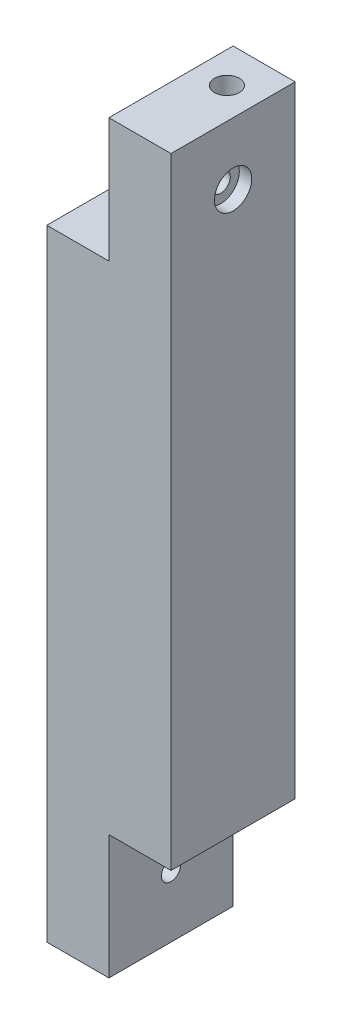
ISO-10303-21;
HEADER;
FILE_DESCRIPTION(('STEP AP214'),'2;1');
FILE_NAME('part.step','',(''),(''),'','','');
FILE_SCHEMA(('AUTOMOTIVE_DESIGN { 1 0 10303 214 1 1 1 1 }'));
ENDSEC;
DATA;
#1=APPLICATION_CONTEXT('core data for automotive mechanical design processes');
#2=APPLICATION_PROTOCOL_DEFINITION('international standard','automotive_design',2000,#1);
#3=PRODUCT_CONTEXT('',#1,'mechanical');
#4=PRODUCT('Part','Part','',(#3));
#5=PRODUCT_RELATED_PRODUCT_CATEGORY('part','',(#4));
#6=PRODUCT_DEFINITION_FORMATION('','',#4);
#7=PRODUCT_DEFINITION_CONTEXT('part definition',#1,'design');
#8=PRODUCT_DEFINITION('design','',#6,#7);
#9=PRODUCT_DEFINITION_SHAPE('','',#8);
#10=(LENGTH_UNIT() NAMED_UNIT(*) SI_UNIT(.MILLI.,.METRE.));
#11=(NAMED_UNIT(*) PLANE_ANGLE_UNIT() SI_UNIT($,.RADIAN.));
#12=(NAMED_UNIT(*) SI_UNIT($,.STERADIAN.) SOLID_ANGLE_UNIT());
#13=UNCERTAINTY_MEASURE_WITH_UNIT(LENGTH_MEASURE(1.E-05),#10,'distance_accuracy_value','');
#14=(GEOMETRIC_REPRESENTATION_CONTEXT(3) GLOBAL_UNCERTAINTY_ASSIGNED_CONTEXT((#13)) GLOBAL_UNIT_ASSIGNED_CONTEXT((#10,
#11,#12)) REPRESENTATION_CONTEXT('',''));
#15=CARTESIAN_POINT('',(0.,0.,0.));
#16=DIRECTION('',(0.,0.,1.));
#17=DIRECTION('',(1.,0.,0.));
#18=AXIS2_PLACEMENT_3D('',#15,#16,#17);
#19=CARTESIAN_POINT('',(-27.9813215779807,10.,6.45386967852447));
#20=DIRECTION('',(1.,0.,0.));
#21=DIRECTION('',(0.,0.,-1.));
#22=AXIS2_PLACEMENT_3D('',#19,#20,#21);
#23=CYLINDRICAL_SURFACE('',#22,1.55);
#24=CARTESIAN_POINT('',(-7.98132157798069,10.,6.45386967852447));
#25=DIRECTION('',(1.,0.,0.));
#26=DIRECTION('',(0.,0.,-1.));
#27=AXIS2_PLACEMENT_3D('',#24,#25,#26);
#28=CIRCLE('',#27,1.55);
#29=CARTESIAN_POINT('',(-7.98132157798069,10.,4.90386967852447));
#30=VERTEX_POINT('',#29);
#31=EDGE_CURVE('E218',#30,#30,#28,.T.);
#32=ORIENTED_EDGE('',*,*,#31,.T.);
#33=EDGE_LOOP('',(#32));
#34=FACE_BOUND('',#33,.T.);
#35=CARTESIAN_POINT('',(-15.9813215779807,10.,6.45386967852447));
#36=DIRECTION('',(-1.,0.,0.));
#37=DIRECTION('',(0.,0.,1.));
#38=AXIS2_PLACEMENT_3D('',#35,#36,#37);
#39=CIRCLE('',#38,1.55);
#40=CARTESIAN_POINT('',(-15.9813215779807,10.,8.00386967852447));
#41=VERTEX_POINT('',#40);
#42=EDGE_CURVE('E54',#41,#41,#39,.F.);
#43=ORIENTED_EDGE('',*,*,#42,.F.);
#44=EDGE_LOOP('',(#43));
#45=FACE_BOUND('',#44,.T.);
#46=ADVANCED_FACE('F50',(#34,#45),#23,.F.);
#47=CARTESIAN_POINT('',(112.018678422019,110.,6.45386967852447));
#48=DIRECTION('',(-1.,0.,0.));
#49=DIRECTION('',(0.,-1.,0.));
#50=AXIS2_PLACEMENT_3D('',#47,#48,#49);
#51=CYLINDRICAL_SURFACE('',#50,1.55);
#52=CARTESIAN_POINT('',(-7.98132157798068,110.,6.45386967852447));
#53=DIRECTION('',(-1.,0.,0.));
#54=DIRECTION('',(0.,-1.,0.));
#55=AXIS2_PLACEMENT_3D('',#52,#53,#54);
#56=CIRCLE('',#55,1.55);
#57=CARTESIAN_POINT('',(-7.98132157798068,108.45,6.45386967852447));
#58=VERTEX_POINT('',#57);
#59=EDGE_CURVE('E133',#58,#58,#56,.T.);
#60=ORIENTED_EDGE('',*,*,#59,.T.);
#61=EDGE_LOOP('',(#60));
#62=FACE_BOUND('',#61,.T.);
#63=CARTESIAN_POINT('',(0.0186784220193165,110.,6.45386967852447));
#64=DIRECTION('',(1.,0.,0.));
#65=DIRECTION('',(0.,0.,-1.));
#66=AXIS2_PLACEMENT_3D('',#63,#64,#65);
#67=CIRCLE('',#66,1.55);
#68=CARTESIAN_POINT('',(0.0186784220193162,110.,4.90386967852447));
#69=VERTEX_POINT('',#68);
#70=EDGE_CURVE('E202',#69,#69,#67,.F.);
#71=ORIENTED_EDGE('',*,*,#70,.F.);
#72=EDGE_LOOP('',(#71));
#73=FACE_BOUND('',#72,.T.);
#74=ADVANCED_FACE('F265',(#62,#73),#51,.F.);
#75=CARTESIAN_POINT('',(0.,0.,0.));
#76=DIRECTION('',(0.,-1.,0.));
#77=DIRECTION('',(0.,0.,-1.));
#78=AXIS2_PLACEMENT_3D('',#75,#76,#77);
#79=PLANE('',#78);
#80=DIRECTION('',(1.,0.,0.));
#81=VECTOR('',#80,1.);
#82=CARTESIAN_POINT('',(-17.9813215779807,0.,-3.54613032147553));
#83=LINE('',#82,#81);
#84=CARTESIAN_POINT('',(-17.9813215779807,0.,-3.54613032147553));
#85=VERTEX_POINT('',#84);
#86=CARTESIAN_POINT('',(-7.98132157798069,0.,-3.54613032147554));
#87=VERTEX_POINT('',#86);
#88=EDGE_CURVE('E179',#85,#87,#83,.T.);
#89=ORIENTED_EDGE('',*,*,#88,.T.);
#90=DIRECTION('',(0.,0.,1.));
#91=VECTOR('',#90,1.);
#92=CARTESIAN_POINT('',(-7.98132157798069,0.,0.));
#93=LINE('',#92,#91);
#94=CARTESIAN_POINT('',(-7.98132157798069,0.,16.4538696785245));
#95=VERTEX_POINT('',#94);
#96=EDGE_CURVE('E60',#87,#95,#93,.T.);
#97=ORIENTED_EDGE('',*,*,#96,.T.);
#98=DIRECTION('',(1.,0.,0.));
#99=VECTOR('',#98,1.);
#100=CARTESIAN_POINT('',(-17.9813215779807,0.,16.4538696785245));
#101=LINE('',#100,#99);
#102=CARTESIAN_POINT('',(-17.9813215779807,0.,16.4538696785245));
#103=VERTEX_POINT('',#102);
#104=EDGE_CURVE('E137',#103,#95,#101,.T.);
#105=ORIENTED_EDGE('',*,*,#104,.F.);
#106=DIRECTION('',(0.,0.,1.));
#107=VECTOR('',#106,1.);
#108=CARTESIAN_POINT('',(-17.9813215779807,0.,-3.54613032147553));
#109=LINE('',#108,#107);
#110=EDGE_CURVE('E169',#85,#103,#109,.T.);
#111=ORIENTED_EDGE('',*,*,#110,.F.);
#112=EDGE_LOOP('',(#89,#97,#105,#111));
#113=FACE_BOUND('',#112,.T.);
#114=ADVANCED_FACE('F271',(#113),#79,.T.);
#115=CARTESIAN_POINT('',(0.,120.,0.));
#116=DIRECTION('',(0.,-1.,0.));
#117=DIRECTION('',(0.,0.,-1.));
#118=AXIS2_PLACEMENT_3D('',#115,#116,#117);
#119=PLANE('',#118);
#120=CARTESIAN_POINT('',(-2.98132157798069,120.,2.45386967852447));
#121=DIRECTION('',(0.,-1.,0.));
#122=DIRECTION('',(0.,0.,-1.));
#123=AXIS2_PLACEMENT_3D('',#120,#121,#122);
#124=CIRCLE('',#123,2.);
#125=CARTESIAN_POINT('',(-2.98132157798069,120.,0.453869678524467));
#126=VERTEX_POINT('',#125);
#127=EDGE_CURVE('E229',#126,#126,#124,.T.);
#128=ORIENTED_EDGE('',*,*,#127,.T.);
#129=EDGE_LOOP('',(#128));
#130=FACE_BOUND('',#129,.T.);
#131=DIRECTION('',(0.,0.,-1.));
#132=VECTOR('',#131,1.);
#133=CARTESIAN_POINT('',(-7.98132157798069,120.,0.));
#134=LINE('',#133,#132);
#135=CARTESIAN_POINT('',(-7.98132157798068,120.,16.4538696785245));
#136=VERTEX_POINT('',#135);
#137=CARTESIAN_POINT('',(-7.98132157798069,120.,-3.54613032147554));
#138=VERTEX_POINT('',#137);
#139=EDGE_CURVE('E198',#136,#138,#134,.T.);
#140=ORIENTED_EDGE('',*,*,#139,.F.);
#141=DIRECTION('',(1.,0.,0.));
#142=VECTOR('',#141,1.);
#143=CARTESIAN_POINT('',(-17.9813215779807,120.,16.4538696785245));
#144=LINE('',#143,#142);
#145=CARTESIAN_POINT('',(2.01867842201931,120.,16.4538696785245));
#146=VERTEX_POINT('',#145);
#147=EDGE_CURVE('E165',#136,#146,#144,.T.);
#148=ORIENTED_EDGE('',*,*,#147,.T.);
#149=DIRECTION('',(0.,0.,1.));
#150=VECTOR('',#149,1.);
#151=CARTESIAN_POINT('',(2.01867842201931,120.,-3.54613032147553));
#152=LINE('',#151,#150);
#153=CARTESIAN_POINT('',(2.01867842201931,120.,-3.54613032147553));
#154=VERTEX_POINT('',#153);
#155=EDGE_CURVE('E168',#154,#146,#152,.T.);
#156=ORIENTED_EDGE('',*,*,#155,.F.);
#157=DIRECTION('',(1.,0.,0.));
#158=VECTOR('',#157,1.);
#159=CARTESIAN_POINT('',(-17.9813215779807,120.,-3.54613032147553));
#160=LINE('',#159,#158);
#161=EDGE_CURVE('E173',#138,#154,#160,.T.);
#162=ORIENTED_EDGE('',*,*,#161,.F.);
#163=EDGE_LOOP('',(#140,#148,#156,#162));
#164=FACE_BOUND('',#163,.T.);
#165=ADVANCED_FACE('F241',(#130,#164),#119,.F.);
#166=CARTESIAN_POINT('',(-17.9813215779807,120.,16.4538696785245));
#167=DIRECTION('',(0.,0.,-1.));
#168=DIRECTION('',(-1.,0.,0.));
#169=AXIS2_PLACEMENT_3D('',#166,#167,#168);
#170=PLANE('',#169);
#171=DIRECTION('',(0.,1.,0.));
#172=VECTOR('',#171,1.);
#173=CARTESIAN_POINT('',(-7.98132157798069,0.,16.4538696785245));
#174=LINE('',#173,#172);
#175=CARTESIAN_POINT('',(-7.98132157798069,20.,16.4538696785245));
#176=VERTEX_POINT('',#175);
#177=EDGE_CURVE('E68',#95,#176,#174,.T.);
#178=ORIENTED_EDGE('',*,*,#177,.T.);
#179=DIRECTION('',(-1.,0.,0.));
#180=VECTOR('',#179,1.);
#181=CARTESIAN_POINT('',(2.01867842201931,20.,16.4538696785245));
#182=LINE('',#181,#180);
#183=CARTESIAN_POINT('',(2.01867842201931,20.,16.4538696785245));
#184=VERTEX_POINT('',#183);
#185=EDGE_CURVE('E126',#184,#176,#182,.T.);
#186=ORIENTED_EDGE('',*,*,#185,.F.);
#187=DIRECTION('',(0.,-1.,0.));
#188=VECTOR('',#187,1.);
#189=CARTESIAN_POINT('',(2.01867842201931,120.,16.4538696785245));
#190=LINE('',#189,#188);
#191=EDGE_CURVE('E195',#146,#184,#190,.T.);
#192=ORIENTED_EDGE('',*,*,#191,.F.);
#193=ORIENTED_EDGE('',*,*,#147,.F.);
#194=DIRECTION('',(0.,-1.,0.));
#195=VECTOR('',#194,1.);
#196=CARTESIAN_POINT('',(-7.98132157798069,120.,16.4538696785245));
#197=LINE('',#196,#195);
#198=CARTESIAN_POINT('',(-7.98132157798068,100.,16.4538696785245));
#199=VERTEX_POINT('',#198);
#200=EDGE_CURVE('E76',#136,#199,#197,.T.);
#201=ORIENTED_EDGE('',*,*,#200,.T.);
#202=DIRECTION('',(1.,0.,0.));
#203=VECTOR('',#202,1.);
#204=CARTESIAN_POINT('',(-17.9813215779807,100.,16.4538696785245));
#205=LINE('',#204,#203);
#206=CARTESIAN_POINT('',(-17.9813215779807,100.,16.4538696785245));
#207=VERTEX_POINT('',#206);
#208=EDGE_CURVE('E146',#207,#199,#205,.T.);
#209=ORIENTED_EDGE('',*,*,#208,.F.);
#210=DIRECTION('',(0.,-1.,0.));
#211=VECTOR('',#210,1.);
#212=CARTESIAN_POINT('',(-17.9813215779807,120.,16.4538696785245));
#213=LINE('',#212,#211);
#214=EDGE_CURVE('E176',#207,#103,#213,.T.);
#215=ORIENTED_EDGE('',*,*,#214,.T.);
#216=ORIENTED_EDGE('',*,*,#104,.T.);
#217=EDGE_LOOP('',(#178,#186,#192,#193,#201,#209,#215,#216));
#218=FACE_BOUND('',#217,.T.);
#219=ADVANCED_FACE('F52',(#218),#170,.F.);
#220=CARTESIAN_POINT('',(2.01867842201931,120.,-3.54613032147553));
#221=DIRECTION('',(1.,0.,0.));
#222=DIRECTION('',(0.,0.,-1.));
#223=AXIS2_PLACEMENT_3D('',#220,#221,#222);
#224=PLANE('',#223);
#225=CARTESIAN_POINT('',(2.01867842201931,110.,6.45386967852447));
#226=DIRECTION('',(1.,0.,0.));
#227=DIRECTION('',(0.,0.,-1.));
#228=AXIS2_PLACEMENT_3D('',#225,#226,#227);
#229=CIRCLE('',#228,3.);
#230=CARTESIAN_POINT('',(2.01867842201931,110.,3.45386967852447));
#231=VERTEX_POINT('',#230);
#232=EDGE_CURVE('E212',#231,#231,#229,.T.);
#233=ORIENTED_EDGE('',*,*,#232,.F.);
#234=EDGE_LOOP('',(#233));
#235=FACE_BOUND('',#234,.T.);
#236=DIRECTION('',(0.,0.,1.));
#237=VECTOR('',#236,1.);
#238=CARTESIAN_POINT('',(2.01867842201931,20.,-103.546130321476));
#239=LINE('',#238,#237);
#240=CARTESIAN_POINT('',(2.01867842201931,20.,-3.54613032147554));
#241=VERTEX_POINT('',#240);
#242=EDGE_CURVE('E123',#241,#184,#239,.T.);
#243=ORIENTED_EDGE('',*,*,#242,.F.);
#244=DIRECTION('',(0.,-1.,0.));
#245=VECTOR('',#244,1.);
#246=CARTESIAN_POINT('',(2.01867842201931,120.,-3.54613032147553));
#247=LINE('',#246,#245);
#248=EDGE_CURVE('E191',#154,#241,#247,.T.);
#249=ORIENTED_EDGE('',*,*,#248,.F.);
#250=ORIENTED_EDGE('',*,*,#155,.T.);
#251=ORIENTED_EDGE('',*,*,#191,.T.);
#252=EDGE_LOOP('',(#243,#249,#250,#251));
#253=FACE_BOUND('',#252,.T.);
#254=ADVANCED_FACE('F291',(#235,#253),#224,.T.);
#255=CARTESIAN_POINT('',(-17.9813215779807,120.,-3.54613032147553));
#256=DIRECTION('',(0.,0.,-1.));
#257=DIRECTION('',(-1.,0.,0.));
#258=AXIS2_PLACEMENT_3D('',#255,#256,#257);
#259=PLANE('',#258);
#260=DIRECTION('',(1.,0.,0.));
#261=VECTOR('',#260,1.);
#262=CARTESIAN_POINT('',(-17.9813215779807,20.,-3.54613032147553));
#263=LINE('',#262,#261);
#264=CARTESIAN_POINT('',(-7.98132157798069,20.,-3.54613032147554));
#265=VERTEX_POINT('',#264);
#266=EDGE_CURVE('E12',#265,#241,#263,.T.);
#267=ORIENTED_EDGE('',*,*,#266,.F.);
#268=DIRECTION('',(0.,-1.,0.));
#269=VECTOR('',#268,1.);
#270=CARTESIAN_POINT('',(-7.98132157798069,120.,-3.54613032147553));
#271=LINE('',#270,#269);
#272=EDGE_CURVE('E119',#265,#87,#271,.T.);
#273=ORIENTED_EDGE('',*,*,#272,.T.);
#274=ORIENTED_EDGE('',*,*,#88,.F.);
#275=DIRECTION('',(0.,-1.,0.));
#276=VECTOR('',#275,1.);
#277=CARTESIAN_POINT('',(-17.9813215779807,120.,-3.54613032147553));
#278=LINE('',#277,#276);
#279=CARTESIAN_POINT('',(-17.9813215779807,100.,-3.54613032147554));
#280=VERTEX_POINT('',#279);
#281=EDGE_CURVE('E188',#280,#85,#278,.T.);
#282=ORIENTED_EDGE('',*,*,#281,.F.);
#283=DIRECTION('',(-1.,0.,0.));
#284=VECTOR('',#283,1.);
#285=CARTESIAN_POINT('',(-17.9813215779807,100.,-3.54613032147553));
#286=LINE('',#285,#284);
#287=CARTESIAN_POINT('',(-7.98132157798068,100.,-3.54613032147554));
#288=VERTEX_POINT('',#287);
#289=EDGE_CURVE('E162',#288,#280,#286,.T.);
#290=ORIENTED_EDGE('',*,*,#289,.F.);
#291=DIRECTION('',(0.,1.,0.));
#292=VECTOR('',#291,1.);
#293=CARTESIAN_POINT('',(-7.98132157798069,120.,-3.54613032147553));
#294=LINE('',#293,#292);
#295=EDGE_CURVE('E156',#288,#138,#294,.T.);
#296=ORIENTED_EDGE('',*,*,#295,.T.);
#297=ORIENTED_EDGE('',*,*,#161,.T.);
#298=ORIENTED_EDGE('',*,*,#248,.T.);
#299=EDGE_LOOP('',(#267,#273,#274,#282,#290,#296,#297,#298));
#300=FACE_BOUND('',#299,.T.);
#301=ADVANCED_FACE('F294',(#300),#259,.T.);
#302=CARTESIAN_POINT('',(-17.9813215779807,120.,-3.54613032147553));
#303=DIRECTION('',(1.,0.,0.));
#304=DIRECTION('',(0.,0.,-1.));
#305=AXIS2_PLACEMENT_3D('',#302,#303,#304);
#306=PLANE('',#305);
#307=CARTESIAN_POINT('',(-17.9813215779807,10.,6.45386967852447));
#308=DIRECTION('',(-1.,0.,0.));
#309=DIRECTION('',(0.,0.,1.));
#310=AXIS2_PLACEMENT_3D('',#307,#308,#309);
#311=CIRCLE('',#310,3.);
#312=CARTESIAN_POINT('',(-17.9813215779807,10.,9.45386967852447));
#313=VERTEX_POINT('',#312);
#314=EDGE_CURVE('E224',#313,#313,#311,.T.);
#315=ORIENTED_EDGE('',*,*,#314,.F.);
#316=EDGE_LOOP('',(#315));
#317=FACE_BOUND('',#316,.T.);
#318=ORIENTED_EDGE('',*,*,#214,.F.);
#319=DIRECTION('',(0.,0.,1.));
#320=VECTOR('',#319,1.);
#321=CARTESIAN_POINT('',(-17.9813215779807,100.,-103.546130321476));
#322=LINE('',#321,#320);
#323=EDGE_CURVE('E153',#280,#207,#322,.T.);
#324=ORIENTED_EDGE('',*,*,#323,.F.);
#325=ORIENTED_EDGE('',*,*,#281,.T.);
#326=ORIENTED_EDGE('',*,*,#110,.T.);
#327=EDGE_LOOP('',(#318,#324,#325,#326));
#328=FACE_BOUND('',#327,.T.);
#329=ADVANCED_FACE('F307',(#317,#328),#306,.F.);
#330=CARTESIAN_POINT('',(-17.9813215779807,100.,-103.546130321476));
#331=DIRECTION('',(0.,-1.,0.));
#332=DIRECTION('',(0.,0.,-1.));
#333=AXIS2_PLACEMENT_3D('',#330,#331,#332);
#334=PLANE('',#333);
#335=ORIENTED_EDGE('',*,*,#289,.T.);
#336=ORIENTED_EDGE('',*,*,#323,.T.);
#337=ORIENTED_EDGE('',*,*,#208,.T.);
#338=DIRECTION('',(0.,0.,1.));
#339=VECTOR('',#338,1.);
#340=CARTESIAN_POINT('',(-7.98132157798068,100.,-103.546130321476));
#341=LINE('',#340,#339);
#342=EDGE_CURVE('E152',#288,#199,#341,.T.);
#343=ORIENTED_EDGE('',*,*,#342,.F.);
#344=EDGE_LOOP('',(#335,#336,#337,#343));
#345=FACE_BOUND('',#344,.T.);
#346=ADVANCED_FACE('F261',(#345),#334,.F.);
#347=CARTESIAN_POINT('',(-7.98132157798069,120.,-103.546130321476));
#348=DIRECTION('',(-1.,0.,0.));
#349=DIRECTION('',(0.,-1.,0.));
#350=AXIS2_PLACEMENT_3D('',#347,#348,#349);
#351=PLANE('',#350);
#352=ORIENTED_EDGE('',*,*,#59,.F.);
#353=EDGE_LOOP('',(#352));
#354=FACE_BOUND('',#353,.T.);
#355=ORIENTED_EDGE('',*,*,#342,.T.);
#356=ORIENTED_EDGE('',*,*,#200,.F.);
#357=ORIENTED_EDGE('',*,*,#139,.T.);
#358=ORIENTED_EDGE('',*,*,#295,.F.);
#359=EDGE_LOOP('',(#355,#356,#357,#358));
#360=FACE_BOUND('',#359,.T.);
#361=ADVANCED_FACE('F252',(#354,#360),#351,.T.);
#362=CARTESIAN_POINT('',(2.01867842201931,20.,-103.546130321476));
#363=DIRECTION('',(0.,1.,0.));
#364=DIRECTION('',(0.,0.,1.));
#365=AXIS2_PLACEMENT_3D('',#362,#363,#364);
#366=PLANE('',#365);
#367=CARTESIAN_POINT('',(-2.98132157798069,20.,2.45386967852447));
#368=DIRECTION('',(0.,-1.,0.));
#369=DIRECTION('',(0.,0.,-1.));
#370=AXIS2_PLACEMENT_3D('',#367,#368,#369);
#371=CIRCLE('',#370,2.);
#372=CARTESIAN_POINT('',(-2.98132157798069,20.,0.453869678524467));
#373=VERTEX_POINT('',#372);
#374=EDGE_CURVE('E233',#373,#373,#371,.T.);
#375=ORIENTED_EDGE('',*,*,#374,.F.);
#376=EDGE_LOOP('',(#375));
#377=FACE_BOUND('',#376,.T.);
#378=ORIENTED_EDGE('',*,*,#266,.T.);
#379=ORIENTED_EDGE('',*,*,#242,.T.);
#380=ORIENTED_EDGE('',*,*,#185,.T.);
#381=DIRECTION('',(0.,0.,1.));
#382=VECTOR('',#381,1.);
#383=CARTESIAN_POINT('',(-7.98132157798069,20.,-103.546130321476));
#384=LINE('',#383,#382);
#385=EDGE_CURVE('E115',#265,#176,#384,.T.);
#386=ORIENTED_EDGE('',*,*,#385,.F.);
#387=EDGE_LOOP('',(#378,#379,#380,#386));
#388=FACE_BOUND('',#387,.T.);
#389=ADVANCED_FACE('F127',(#377,#388),#366,.F.);
#390=CARTESIAN_POINT('',(-7.98132157798069,0.,-103.546130321476));
#391=DIRECTION('',(1.,0.,0.));
#392=DIRECTION('',(0.,0.,-1.));
#393=AXIS2_PLACEMENT_3D('',#390,#391,#392);
#394=PLANE('',#393);
#395=ORIENTED_EDGE('',*,*,#31,.F.);
#396=EDGE_LOOP('',(#395));
#397=FACE_BOUND('',#396,.T.);
#398=ORIENTED_EDGE('',*,*,#385,.T.);
#399=ORIENTED_EDGE('',*,*,#177,.F.);
#400=ORIENTED_EDGE('',*,*,#96,.F.);
#401=ORIENTED_EDGE('',*,*,#272,.F.);
#402=EDGE_LOOP('',(#398,#399,#400,#401));
#403=FACE_BOUND('',#402,.T.);
#404=ADVANCED_FACE('F117',(#397,#403),#394,.T.);
#405=CARTESIAN_POINT('',(0.018678422019313,110.,6.45386967852447));
#406=DIRECTION('',(1.,0.,0.));
#407=DIRECTION('',(0.,0.,-1.));
#408=AXIS2_PLACEMENT_3D('',#405,#406,#407);
#409=PLANE('',#408);
#410=CARTESIAN_POINT('',(0.018678422019313,110.,6.45386967852447));
#411=DIRECTION('',(1.,0.,0.));
#412=DIRECTION('',(0.,0.,-1.));
#413=AXIS2_PLACEMENT_3D('',#410,#411,#412);
#414=CIRCLE('',#413,3.);
#415=CARTESIAN_POINT('',(0.0186784220193125,110.,3.45386967852447));
#416=VERTEX_POINT('',#415);
#417=EDGE_CURVE('E205',#416,#416,#414,.T.);
#418=ORIENTED_EDGE('',*,*,#417,.T.);
#419=EDGE_LOOP('',(#418));
#420=FACE_BOUND('',#419,.T.);
#421=ORIENTED_EDGE('',*,*,#70,.T.);
#422=EDGE_LOOP('',(#421));
#423=FACE_BOUND('',#422,.T.);
#424=ADVANCED_FACE('F258',(#420,#423),#409,.T.);
#425=CARTESIAN_POINT('',(0.018678422019313,110.,6.45386967852447));
#426=DIRECTION('',(1.,0.,0.));
#427=DIRECTION('',(0.,0.,-1.));
#428=AXIS2_PLACEMENT_3D('',#425,#426,#427);
#429=CYLINDRICAL_SURFACE('',#428,3.);
#430=ORIENTED_EDGE('',*,*,#417,.F.);
#431=EDGE_LOOP('',(#430));
#432=FACE_BOUND('',#431,.T.);
#433=ORIENTED_EDGE('',*,*,#232,.T.);
#434=EDGE_LOOP('',(#433));
#435=FACE_BOUND('',#434,.T.);
#436=ADVANCED_FACE('F280',(#432,#435),#429,.F.);
#437=CARTESIAN_POINT('',(-15.9813215779807,10.,6.45386967852447));
#438=DIRECTION('',(-1.,0.,0.));
#439=DIRECTION('',(0.,0.,1.));
#440=AXIS2_PLACEMENT_3D('',#437,#438,#439);
#441=PLANE('',#440);
#442=CARTESIAN_POINT('',(-15.9813215779807,10.,6.45386967852447));
#443=DIRECTION('',(-1.,0.,0.));
#444=DIRECTION('',(0.,0.,1.));
#445=AXIS2_PLACEMENT_3D('',#442,#443,#444);
#446=CIRCLE('',#445,3.);
#447=CARTESIAN_POINT('',(-15.9813215779807,10.,9.45386967852447));
#448=VERTEX_POINT('',#447);
#449=EDGE_CURVE('E228',#448,#448,#446,.T.);
#450=ORIENTED_EDGE('',*,*,#449,.T.);
#451=EDGE_LOOP('',(#450));
#452=FACE_BOUND('',#451,.T.);
#453=ORIENTED_EDGE('',*,*,#42,.T.);
#454=EDGE_LOOP('',(#453));
#455=FACE_BOUND('',#454,.T.);
#456=ADVANCED_FACE('F282',(#452,#455),#441,.T.);
#457=CARTESIAN_POINT('',(-15.9813215779807,10.,6.45386967852447));
#458=DIRECTION('',(-1.,0.,0.));
#459=DIRECTION('',(0.,0.,1.));
#460=AXIS2_PLACEMENT_3D('',#457,#458,#459);
#461=CYLINDRICAL_SURFACE('',#460,3.);
#462=ORIENTED_EDGE('',*,*,#449,.F.);
#463=EDGE_LOOP('',(#462));
#464=FACE_BOUND('',#463,.T.);
#465=ORIENTED_EDGE('',*,*,#314,.T.);
#466=EDGE_LOOP('',(#465));
#467=FACE_BOUND('',#466,.T.);
#468=ADVANCED_FACE('F247',(#464,#467),#461,.F.);
#469=CARTESIAN_POINT('',(-2.98132157798069,120.,2.45386967852447));
#470=DIRECTION('',(0.,-1.,0.));
#471=DIRECTION('',(0.,0.,-1.));
#472=AXIS2_PLACEMENT_3D('',#469,#470,#471);
#473=CYLINDRICAL_SURFACE('',#472,2.);
#474=ORIENTED_EDGE('',*,*,#127,.F.);
#475=EDGE_LOOP('',(#474));
#476=FACE_BOUND('',#475,.T.);
#477=ORIENTED_EDGE('',*,*,#374,.T.);
#478=EDGE_LOOP('',(#477));
#479=FACE_BOUND('',#478,.T.);
#480=ADVANCED_FACE('F244',(#476,#479),#473,.F.);
#481=CLOSED_SHELL('',(#46,#74,#114,#165,#219,#254,#301,#329,#346,#361,#389,#404,#424,#436,#456,
#468,#480));
#482=MANIFOLD_SOLID_BREP('B2',#481);
#483=ADVANCED_BREP_SHAPE_REPRESENTATION('',(#18,#482),#14);
#484=SHAPE_DEFINITION_REPRESENTATION(#9,#483);
ENDSEC;
END-ISO-10303-21;
